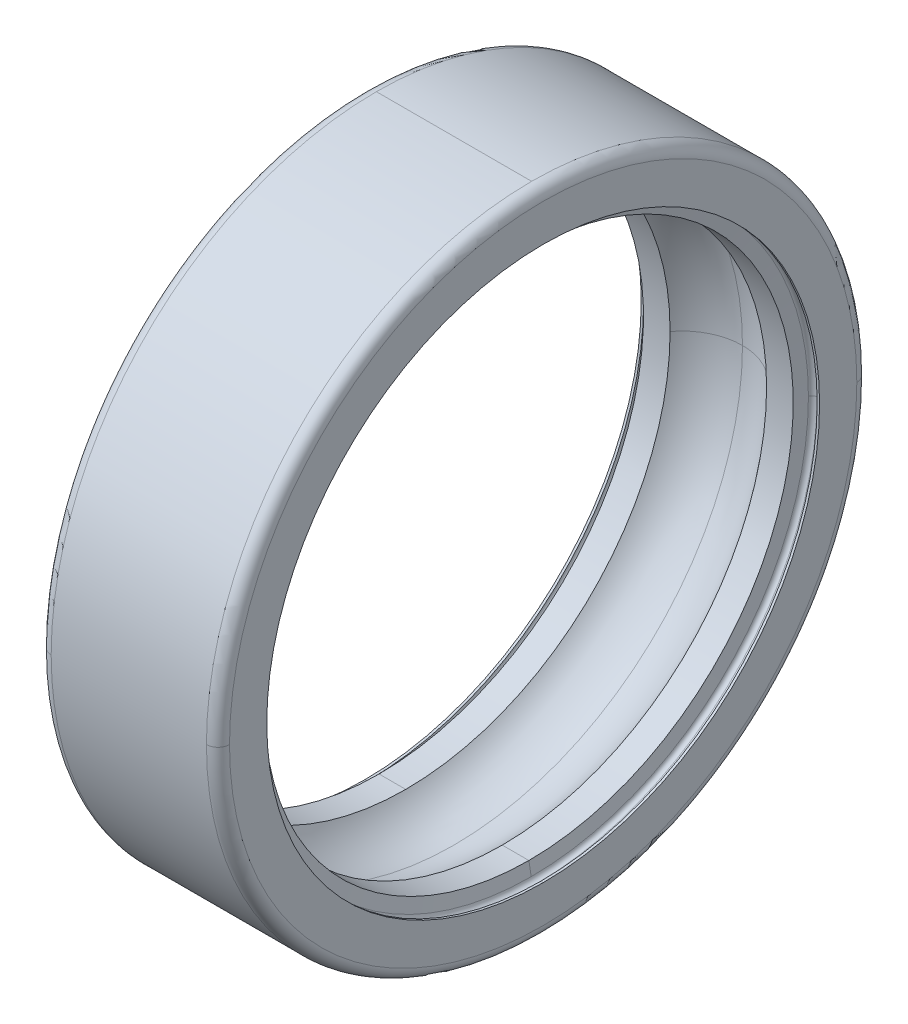
ISO-10303-21;
HEADER;
FILE_DESCRIPTION(('STEP AP214'),'2;1');
FILE_NAME('part.step','',(''),(''),'','','');
FILE_SCHEMA(('AUTOMOTIVE_DESIGN { 1 0 10303 214 1 1 1 1 }'));
ENDSEC;
DATA;
#1=APPLICATION_CONTEXT('core data for automotive mechanical design processes');
#2=APPLICATION_PROTOCOL_DEFINITION('international standard','automotive_design',2000,#1);
#3=PRODUCT_CONTEXT('',#1,'mechanical');
#4=PRODUCT('Part','Part','',(#3));
#5=PRODUCT_RELATED_PRODUCT_CATEGORY('part','',(#4));
#6=PRODUCT_DEFINITION_FORMATION('','',#4);
#7=PRODUCT_DEFINITION_CONTEXT('part definition',#1,'design');
#8=PRODUCT_DEFINITION('design','',#6,#7);
#9=PRODUCT_DEFINITION_SHAPE('','',#8);
#10=(LENGTH_UNIT() NAMED_UNIT(*) SI_UNIT(.MILLI.,.METRE.));
#11=(NAMED_UNIT(*) PLANE_ANGLE_UNIT() SI_UNIT($,.RADIAN.));
#12=(NAMED_UNIT(*) SI_UNIT($,.STERADIAN.) SOLID_ANGLE_UNIT());
#13=UNCERTAINTY_MEASURE_WITH_UNIT(LENGTH_MEASURE(1.E-05),#10,'distance_accuracy_value','');
#14=(GEOMETRIC_REPRESENTATION_CONTEXT(3) GLOBAL_UNCERTAINTY_ASSIGNED_CONTEXT((#13)) GLOBAL_UNIT_ASSIGNED_CONTEXT((#10,
#11,#12)) REPRESENTATION_CONTEXT('',''));
#15=CARTESIAN_POINT('',(0.,0.,0.));
#16=DIRECTION('',(0.,0.,1.));
#17=DIRECTION('',(1.,0.,0.));
#18=AXIS2_PLACEMENT_3D('',#15,#16,#17);
#19=CARTESIAN_POINT('',(16.31,0.,0.));
#20=DIRECTION('',(1.,0.,0.));
#21=DIRECTION('',(0.,0.,-1.));
#22=AXIS2_PLACEMENT_3D('',#19,#20,#21);
#23=TOROIDAL_SURFACE('',#22,26.35,0.46);
#24=CARTESIAN_POINT('',(16.31,0.,0.));
#25=DIRECTION('',(1.,0.,0.));
#26=DIRECTION('',(0.,0.,1.));
#27=AXIS2_PLACEMENT_3D('',#24,#25,#26);
#28=CIRCLE('',#27,26.81);
#29=CARTESIAN_POINT('',(16.31,0.,-26.81));
#30=VERTEX_POINT('',#29);
#31=CARTESIAN_POINT('',(16.31,0.,26.81));
#32=VERTEX_POINT('',#31);
#33=EDGE_CURVE('E339',#30,#32,#28,.T.);
#34=ORIENTED_EDGE('',*,*,#33,.T.);
#35=CARTESIAN_POINT('',(16.31,0.,26.35));
#36=DIRECTION('',(0.,-1.,0.));
#37=DIRECTION('',(0.,0.,1.));
#38=AXIS2_PLACEMENT_3D('',#35,#36,#37);
#39=CIRCLE('',#38,0.46);
#40=CARTESIAN_POINT('',(15.8569884336144,0.,26.4298781617268));
#41=VERTEX_POINT('',#40);
#42=EDGE_CURVE('E209',#32,#41,#39,.T.);
#43=ORIENTED_EDGE('',*,*,#42,.T.);
#44=CARTESIAN_POINT('',(15.8569884336144,0.,0.));
#45=DIRECTION('',(1.,0.,0.));
#46=DIRECTION('',(0.,1.,0.));
#47=AXIS2_PLACEMENT_3D('',#44,#45,#46);
#48=CIRCLE('',#47,26.4298781617268);
#49=CARTESIAN_POINT('',(15.8569884336144,26.4298781617268,0.));
#50=VERTEX_POINT('',#49);
#51=EDGE_CURVE('E33',#50,#41,#48,.T.);
#52=ORIENTED_EDGE('',*,*,#51,.F.);
#53=CARTESIAN_POINT('',(15.8569884336144,0.,0.));
#54=DIRECTION('',(1.,0.,0.));
#55=DIRECTION('',(0.,1.,0.));
#56=AXIS2_PLACEMENT_3D('',#53,#54,#55);
#57=CIRCLE('',#56,26.4298781617268);
#58=CARTESIAN_POINT('',(15.8569884336144,0.,-26.4298781617268));
#59=VERTEX_POINT('',#58);
#60=EDGE_CURVE('E246',#59,#50,#57,.T.);
#61=ORIENTED_EDGE('',*,*,#60,.F.);
#62=CARTESIAN_POINT('',(16.31,0.,-26.35));
#63=DIRECTION('',(0.,-1.,0.));
#64=DIRECTION('',(0.,0.,-1.));
#65=AXIS2_PLACEMENT_3D('',#62,#63,#64);
#66=CIRCLE('',#65,0.46);
#67=EDGE_CURVE('E200',#59,#30,#66,.T.);
#68=ORIENTED_EDGE('',*,*,#67,.T.);
#69=EDGE_LOOP('',(#34,#43,#52,#61,#68));
#70=FACE_BOUND('',#69,.T.);
#71=ADVANCED_FACE('F16',(#70),#23,.F.);
#72=CARTESIAN_POINT('',(16.885,0.,0.));
#73=DIRECTION('',(1.,0.,0.));
#74=DIRECTION('',(0.,1.,0.));
#75=AXIS2_PLACEMENT_3D('',#72,#73,#74);
#76=CYLINDRICAL_SURFACE('',#75,26.35);
#77=DIRECTION('',(1.,0.,0.));
#78=VECTOR('',#77,1.);
#79=CARTESIAN_POINT('',(16.885,26.35,0.));
#80=LINE('',#79,#78);
#81=CARTESIAN_POINT('',(16.77,26.35,0.));
#82=VERTEX_POINT('',#81);
#83=CARTESIAN_POINT('',(17.,26.35,0.));
#84=VERTEX_POINT('',#83);
#85=EDGE_CURVE('E211',#82,#84,#80,.T.);
#86=ORIENTED_EDGE('',*,*,#85,.T.);
#87=CARTESIAN_POINT('',(17.,0.,0.));
#88=DIRECTION('',(1.,0.,0.));
#89=DIRECTION('',(0.,1.,0.));
#90=AXIS2_PLACEMENT_3D('',#87,#88,#89);
#91=CIRCLE('',#90,26.35);
#92=CARTESIAN_POINT('',(17.,-26.35,0.));
#93=VERTEX_POINT('',#92);
#94=EDGE_CURVE('E11',#84,#93,#91,.T.);
#95=ORIENTED_EDGE('',*,*,#94,.T.);
#96=DIRECTION('',(-1.,0.,0.));
#97=VECTOR('',#96,1.);
#98=CARTESIAN_POINT('',(16.885,-26.35,0.));
#99=LINE('',#98,#97);
#100=CARTESIAN_POINT('',(16.77,-26.35,0.));
#101=VERTEX_POINT('',#100);
#102=EDGE_CURVE('E216',#93,#101,#99,.T.);
#103=ORIENTED_EDGE('',*,*,#102,.T.);
#104=CARTESIAN_POINT('',(16.77,0.,0.));
#105=DIRECTION('',(1.,0.,0.));
#106=DIRECTION('',(0.,1.,0.));
#107=AXIS2_PLACEMENT_3D('',#104,#105,#106);
#108=CIRCLE('',#107,26.35);
#109=CARTESIAN_POINT('',(16.77,0.,26.35));
#110=VERTEX_POINT('',#109);
#111=EDGE_CURVE('E419',#110,#101,#108,.T.);
#112=ORIENTED_EDGE('',*,*,#111,.F.);
#113=CARTESIAN_POINT('',(16.77,0.,0.));
#114=DIRECTION('',(1.,0.,0.));
#115=DIRECTION('',(0.,1.,0.));
#116=AXIS2_PLACEMENT_3D('',#113,#114,#115);
#117=CIRCLE('',#116,26.35);
#118=EDGE_CURVE('E364',#82,#110,#117,.T.);
#119=ORIENTED_EDGE('',*,*,#118,.F.);
#120=EDGE_LOOP('',(#86,#95,#103,#112,#119));
#121=FACE_BOUND('',#120,.T.);
#122=ADVANCED_FACE('F330',(#121),#76,.F.);
#123=CARTESIAN_POINT('',(17.,28.125,0.));
#124=DIRECTION('',(1.,0.,0.));
#125=DIRECTION('',(0.,1.,0.));
#126=AXIS2_PLACEMENT_3D('',#123,#124,#125);
#127=PLANE('',#126);
#128=ORIENTED_EDGE('',*,*,#94,.F.);
#129=CARTESIAN_POINT('',(17.,0.,0.));
#130=DIRECTION('',(1.,0.,0.));
#131=DIRECTION('',(0.,1.,0.));
#132=AXIS2_PLACEMENT_3D('',#129,#130,#131);
#133=CIRCLE('',#132,26.35);
#134=EDGE_CURVE('E220',#93,#84,#133,.T.);
#135=ORIENTED_EDGE('',*,*,#134,.F.);
#136=EDGE_LOOP('',(#128,#135));
#137=FACE_BOUND('',#136,.T.);
#138=CARTESIAN_POINT('',(17.,0.,0.));
#139=DIRECTION('',(1.,0.,0.));
#140=DIRECTION('',(0.,1.,0.));
#141=AXIS2_PLACEMENT_3D('',#138,#139,#140);
#142=CIRCLE('',#141,29.9);
#143=CARTESIAN_POINT('',(17.,0.,29.9));
#144=VERTEX_POINT('',#143);
#145=CARTESIAN_POINT('',(17.,0.,-29.9));
#146=VERTEX_POINT('',#145);
#147=EDGE_CURVE('E25',#144,#146,#142,.T.);
#148=ORIENTED_EDGE('',*,*,#147,.T.);
#149=CARTESIAN_POINT('',(17.,0.,0.));
#150=DIRECTION('',(1.,0.,0.));
#151=DIRECTION('',(0.,1.,0.));
#152=AXIS2_PLACEMENT_3D('',#149,#150,#151);
#153=CIRCLE('',#152,29.9);
#154=EDGE_CURVE('E233',#146,#144,#153,.T.);
#155=ORIENTED_EDGE('',*,*,#154,.T.);
#156=EDGE_LOOP('',(#148,#155));
#157=FACE_BOUND('',#156,.T.);
#158=ADVANCED_FACE('F334',(#137,#157),#127,.T.);
#159=CARTESIAN_POINT('',(15.9,0.,0.));
#160=DIRECTION('',(1.,0.,0.));
#161=DIRECTION('',(0.,0.,-1.));
#162=AXIS2_PLACEMENT_3D('',#159,#160,#161);
#163=TOROIDAL_SURFACE('',#162,29.9,1.1);
#164=CARTESIAN_POINT('',(15.9,0.,-29.9));
#165=DIRECTION('',(0.,-1.,0.));
#166=DIRECTION('',(0.,0.,-1.));
#167=AXIS2_PLACEMENT_3D('',#164,#165,#166);
#168=CIRCLE('',#167,1.1);
#169=CARTESIAN_POINT('',(15.9,0.,-31.));
#170=VERTEX_POINT('',#169);
#171=EDGE_CURVE('E226',#170,#146,#168,.T.);
#172=ORIENTED_EDGE('',*,*,#171,.T.);
#173=ORIENTED_EDGE('',*,*,#147,.F.);
#174=CARTESIAN_POINT('',(15.9,0.,29.9));
#175=DIRECTION('',(0.,-1.,0.));
#176=DIRECTION('',(0.,0.,1.));
#177=AXIS2_PLACEMENT_3D('',#174,#175,#176);
#178=CIRCLE('',#177,1.1);
#179=CARTESIAN_POINT('',(15.9,0.,31.));
#180=VERTEX_POINT('',#179);
#181=EDGE_CURVE('E237',#144,#180,#178,.T.);
#182=ORIENTED_EDGE('',*,*,#181,.T.);
#183=CARTESIAN_POINT('',(15.9,0.,0.));
#184=DIRECTION('',(1.,0.,0.));
#185=DIRECTION('',(0.,1.,0.));
#186=AXIS2_PLACEMENT_3D('',#183,#184,#185);
#187=CIRCLE('',#186,31.);
#188=CARTESIAN_POINT('',(15.9,-31.,0.));
#189=VERTEX_POINT('',#188);
#190=EDGE_CURVE('E253',#180,#189,#187,.T.);
#191=ORIENTED_EDGE('',*,*,#190,.T.);
#192=CARTESIAN_POINT('',(15.9,0.,0.));
#193=DIRECTION('',(1.,0.,0.));
#194=DIRECTION('',(0.,1.,0.));
#195=AXIS2_PLACEMENT_3D('',#192,#193,#194);
#196=CIRCLE('',#195,31.);
#197=EDGE_CURVE('E221',#189,#170,#196,.T.);
#198=ORIENTED_EDGE('',*,*,#197,.T.);
#199=EDGE_LOOP('',(#172,#173,#182,#191,#198));
#200=FACE_BOUND('',#199,.T.);
#201=ADVANCED_FACE('F326',(#200),#163,.T.);
#202=CARTESIAN_POINT('',(8.5,0.,0.));
#203=DIRECTION('',(1.,0.,0.));
#204=DIRECTION('',(0.,1.,0.));
#205=AXIS2_PLACEMENT_3D('',#202,#203,#204);
#206=CYLINDRICAL_SURFACE('',#205,31.);
#207=DIRECTION('',(1.,0.,0.));
#208=VECTOR('',#207,1.);
#209=CARTESIAN_POINT('',(8.5,31.,0.));
#210=LINE('',#209,#208);
#211=CARTESIAN_POINT('',(1.1,31.,0.));
#212=VERTEX_POINT('',#211);
#213=CARTESIAN_POINT('',(15.9,31.,0.));
#214=VERTEX_POINT('',#213);
#215=EDGE_CURVE('E236',#212,#214,#210,.T.);
#216=ORIENTED_EDGE('',*,*,#215,.T.);
#217=CARTESIAN_POINT('',(15.9,0.,0.));
#218=DIRECTION('',(1.,0.,0.));
#219=DIRECTION('',(0.,1.,0.));
#220=AXIS2_PLACEMENT_3D('',#217,#218,#219);
#221=CIRCLE('',#220,31.);
#222=EDGE_CURVE('E229',#170,#214,#221,.T.);
#223=ORIENTED_EDGE('',*,*,#222,.F.);
#224=ORIENTED_EDGE('',*,*,#197,.F.);
#225=DIRECTION('',(-1.,0.,0.));
#226=VECTOR('',#225,1.);
#227=CARTESIAN_POINT('',(8.5,-31.,0.));
#228=LINE('',#227,#226);
#229=CARTESIAN_POINT('',(1.1,-31.,0.));
#230=VERTEX_POINT('',#229);
#231=EDGE_CURVE('E250',#189,#230,#228,.T.);
#232=ORIENTED_EDGE('',*,*,#231,.T.);
#233=CARTESIAN_POINT('',(1.1,0.,0.));
#234=DIRECTION('',(1.,0.,0.));
#235=DIRECTION('',(0.,1.,0.));
#236=AXIS2_PLACEMENT_3D('',#233,#234,#235);
#237=CIRCLE('',#236,31.);
#238=CARTESIAN_POINT('',(1.1,0.,-31.));
#239=VERTEX_POINT('',#238);
#240=EDGE_CURVE('E19',#230,#239,#237,.T.);
#241=ORIENTED_EDGE('',*,*,#240,.T.);
#242=CARTESIAN_POINT('',(1.1,0.,0.));
#243=DIRECTION('',(1.,0.,0.));
#244=DIRECTION('',(0.,1.,0.));
#245=AXIS2_PLACEMENT_3D('',#242,#243,#244);
#246=CIRCLE('',#245,31.);
#247=EDGE_CURVE('E269',#239,#212,#246,.T.);
#248=ORIENTED_EDGE('',*,*,#247,.T.);
#249=EDGE_LOOP('',(#216,#223,#224,#232,#241,#248));
#250=FACE_BOUND('',#249,.T.);
#251=ADVANCED_FACE('F306',(#250),#206,.T.);
#252=CARTESIAN_POINT('',(1.1,0.,0.));
#253=DIRECTION('',(1.,0.,0.));
#254=DIRECTION('',(0.,0.,-1.));
#255=AXIS2_PLACEMENT_3D('',#252,#253,#254);
#256=TOROIDAL_SURFACE('',#255,29.9,1.1);
#257=CARTESIAN_POINT('',(1.1,0.,-29.9));
#258=DIRECTION('',(0.,-1.,0.));
#259=DIRECTION('',(0.,0.,-1.));
#260=AXIS2_PLACEMENT_3D('',#257,#258,#259);
#261=CIRCLE('',#260,1.1);
#262=CARTESIAN_POINT('',(0.,0.,-29.9));
#263=VERTEX_POINT('',#262);
#264=EDGE_CURVE('E257',#263,#239,#261,.T.);
#265=ORIENTED_EDGE('',*,*,#264,.T.);
#266=ORIENTED_EDGE('',*,*,#240,.F.);
#267=CARTESIAN_POINT('',(1.1,0.,0.));
#268=DIRECTION('',(1.,0.,0.));
#269=DIRECTION('',(0.,1.,0.));
#270=AXIS2_PLACEMENT_3D('',#267,#268,#269);
#271=CIRCLE('',#270,31.);
#272=CARTESIAN_POINT('',(1.1,0.,31.));
#273=VERTEX_POINT('',#272);
#274=EDGE_CURVE('E243',#273,#230,#271,.T.);
#275=ORIENTED_EDGE('',*,*,#274,.F.);
#276=CARTESIAN_POINT('',(1.1,0.,29.9));
#277=DIRECTION('',(0.,-1.,0.));
#278=DIRECTION('',(0.,0.,1.));
#279=AXIS2_PLACEMENT_3D('',#276,#277,#278);
#280=CIRCLE('',#279,1.1);
#281=CARTESIAN_POINT('',(0.,0.,29.9));
#282=VERTEX_POINT('',#281);
#283=EDGE_CURVE('E266',#273,#282,#280,.T.);
#284=ORIENTED_EDGE('',*,*,#283,.T.);
#285=CARTESIAN_POINT('',(0.,0.,0.));
#286=DIRECTION('',(1.,0.,0.));
#287=DIRECTION('',(0.,1.,0.));
#288=AXIS2_PLACEMENT_3D('',#285,#286,#287);
#289=CIRCLE('',#288,29.9);
#290=EDGE_CURVE('E260',#282,#263,#289,.T.);
#291=ORIENTED_EDGE('',*,*,#290,.T.);
#292=EDGE_LOOP('',(#265,#266,#275,#284,#291));
#293=FACE_BOUND('',#292,.T.);
#294=ADVANCED_FACE('F314',(#293),#256,.T.);
#295=CARTESIAN_POINT('',(0.,28.125,0.));
#296=DIRECTION('',(-1.,0.,0.));
#297=DIRECTION('',(0.,0.,1.));
#298=AXIS2_PLACEMENT_3D('',#295,#296,#297);
#299=PLANE('',#298);
#300=CARTESIAN_POINT('',(0.,0.,0.));
#301=DIRECTION('',(1.,0.,0.));
#302=DIRECTION('',(0.,1.,0.));
#303=AXIS2_PLACEMENT_3D('',#300,#301,#302);
#304=CIRCLE('',#303,26.35);
#305=CARTESIAN_POINT('',(0.,26.35,0.));
#306=VERTEX_POINT('',#305);
#307=CARTESIAN_POINT('',(0.,-26.35,0.));
#308=VERTEX_POINT('',#307);
#309=EDGE_CURVE('E258',#306,#308,#304,.T.);
#310=ORIENTED_EDGE('',*,*,#309,.T.);
#311=CARTESIAN_POINT('',(0.,0.,0.));
#312=DIRECTION('',(1.,0.,0.));
#313=DIRECTION('',(0.,1.,0.));
#314=AXIS2_PLACEMENT_3D('',#311,#312,#313);
#315=CIRCLE('',#314,26.35);
#316=EDGE_CURVE('E280',#308,#306,#315,.T.);
#317=ORIENTED_EDGE('',*,*,#316,.T.);
#318=EDGE_LOOP('',(#310,#317));
#319=FACE_BOUND('',#318,.T.);
#320=CARTESIAN_POINT('',(0.,0.,0.));
#321=DIRECTION('',(1.,0.,0.));
#322=DIRECTION('',(0.,1.,0.));
#323=AXIS2_PLACEMENT_3D('',#320,#321,#322);
#324=CIRCLE('',#323,29.9);
#325=EDGE_CURVE('E263',#263,#282,#324,.T.);
#326=ORIENTED_EDGE('',*,*,#325,.F.);
#327=ORIENTED_EDGE('',*,*,#290,.F.);
#328=EDGE_LOOP('',(#326,#327));
#329=FACE_BOUND('',#328,.T.);
#330=ADVANCED_FACE('F316',(#319,#329),#299,.T.);
#331=CARTESIAN_POINT('',(0.114999999999998,0.,0.));
#332=DIRECTION('',(1.,0.,0.));
#333=DIRECTION('',(0.,1.,0.));
#334=AXIS2_PLACEMENT_3D('',#331,#332,#333);
#335=CYLINDRICAL_SURFACE('',#334,26.35);
#336=DIRECTION('',(1.,0.,0.));
#337=VECTOR('',#336,1.);
#338=CARTESIAN_POINT('',(0.114999999999998,26.35,0.));
#339=LINE('',#338,#337);
#340=CARTESIAN_POINT('',(0.23,26.35,0.));
#341=VERTEX_POINT('',#340);
#342=EDGE_CURVE('E276',#306,#341,#339,.T.);
#343=ORIENTED_EDGE('',*,*,#342,.T.);
#344=CARTESIAN_POINT('',(0.23,0.,0.));
#345=DIRECTION('',(1.,0.,0.));
#346=DIRECTION('',(0.,1.,0.));
#347=AXIS2_PLACEMENT_3D('',#344,#345,#346);
#348=CIRCLE('',#347,26.35);
#349=CARTESIAN_POINT('',(0.23,0.,26.35));
#350=VERTEX_POINT('',#349);
#351=EDGE_CURVE('E169',#341,#350,#348,.T.);
#352=ORIENTED_EDGE('',*,*,#351,.T.);
#353=CARTESIAN_POINT('',(0.23,0.,0.));
#354=DIRECTION('',(1.,0.,0.));
#355=DIRECTION('',(0.,1.,0.));
#356=AXIS2_PLACEMENT_3D('',#353,#354,#355);
#357=CIRCLE('',#356,26.35);
#358=CARTESIAN_POINT('',(0.23,-26.35,0.));
#359=VERTEX_POINT('',#358);
#360=EDGE_CURVE('E289',#350,#359,#357,.T.);
#361=ORIENTED_EDGE('',*,*,#360,.T.);
#362=DIRECTION('',(-1.,0.,0.));
#363=VECTOR('',#362,1.);
#364=CARTESIAN_POINT('',(0.114999999999998,-26.35,0.));
#365=LINE('',#364,#363);
#366=EDGE_CURVE('E285',#359,#308,#365,.T.);
#367=ORIENTED_EDGE('',*,*,#366,.T.);
#368=ORIENTED_EDGE('',*,*,#309,.F.);
#369=EDGE_LOOP('',(#343,#352,#361,#367,#368));
#370=FACE_BOUND('',#369,.T.);
#371=ADVANCED_FACE('F323',(#370),#335,.F.);
#372=CARTESIAN_POINT('',(0.69,0.,0.));
#373=DIRECTION('',(1.,0.,0.));
#374=DIRECTION('',(0.,0.,-1.));
#375=AXIS2_PLACEMENT_3D('',#372,#373,#374);
#376=TOROIDAL_SURFACE('',#375,26.35,0.46);
#377=CARTESIAN_POINT('',(0.69,0.,0.));
#378=DIRECTION('',(1.,0.,0.));
#379=DIRECTION('',(0.,0.,1.));
#380=AXIS2_PLACEMENT_3D('',#377,#378,#379);
#381=CIRCLE('',#380,26.81);
#382=CARTESIAN_POINT('',(0.69,0.,-26.81));
#383=VERTEX_POINT('',#382);
#384=CARTESIAN_POINT('',(0.69,0.,26.81));
#385=VERTEX_POINT('',#384);
#386=EDGE_CURVE('E380',#383,#385,#381,.T.);
#387=ORIENTED_EDGE('',*,*,#386,.T.);
#388=CARTESIAN_POINT('',(0.69,0.,26.35));
#389=DIRECTION('',(0.,-1.,0.));
#390=DIRECTION('',(0.,0.,1.));
#391=AXIS2_PLACEMENT_3D('',#388,#389,#390);
#392=CIRCLE('',#391,0.46);
#393=EDGE_CURVE('E194',#385,#350,#392,.T.);
#394=ORIENTED_EDGE('',*,*,#393,.T.);
#395=ORIENTED_EDGE('',*,*,#351,.F.);
#396=CARTESIAN_POINT('',(0.23,0.,0.));
#397=DIRECTION('',(1.,0.,0.));
#398=DIRECTION('',(0.,1.,0.));
#399=AXIS2_PLACEMENT_3D('',#396,#397,#398);
#400=CIRCLE('',#399,26.35);
#401=CARTESIAN_POINT('',(0.23,0.,-26.35));
#402=VERTEX_POINT('',#401);
#403=EDGE_CURVE('E284',#402,#341,#400,.T.);
#404=ORIENTED_EDGE('',*,*,#403,.F.);
#405=CARTESIAN_POINT('',(0.69,0.,-26.35));
#406=DIRECTION('',(0.,-1.,0.));
#407=DIRECTION('',(0.,0.,-1.));
#408=AXIS2_PLACEMENT_3D('',#405,#406,#407);
#409=CIRCLE('',#408,0.46);
#410=EDGE_CURVE('E286',#402,#383,#409,.T.);
#411=ORIENTED_EDGE('',*,*,#410,.T.);
#412=EDGE_LOOP('',(#387,#394,#395,#404,#411));
#413=FACE_BOUND('',#412,.T.);
#414=ADVANCED_FACE('F516',(#413),#376,.F.);
#415=CARTESIAN_POINT('',(1.2514419178339,0.,0.));
#416=DIRECTION('',(-1.,0.,0.));
#417=DIRECTION('',(0.,1.,0.));
#418=AXIS2_PLACEMENT_3D('',#415,#416,#417);
#419=CONICAL_SURFACE('',#418,25.8149390808634,1.39626340159546);
#420=DIRECTION('',(0.173648177666931,-0.984807753012208,0.));
#421=VECTOR('',#420,1.);
#422=CARTESIAN_POINT('',(1.2514419178339,25.8149390808634,0.));
#423=LINE('',#422,#421);
#424=CARTESIAN_POINT('',(1.14301156638562,26.4298781617268,0.));
#425=VERTEX_POINT('',#424);
#426=CARTESIAN_POINT('',(1.35987226928218,25.2,0.));
#427=VERTEX_POINT('',#426);
#428=EDGE_CURVE('E167',#425,#427,#423,.T.);
#429=ORIENTED_EDGE('',*,*,#428,.T.);
#430=CARTESIAN_POINT('',(1.35987226928218,0.,0.));
#431=DIRECTION('',(1.,0.,0.));
#432=DIRECTION('',(0.,1.,0.));
#433=AXIS2_PLACEMENT_3D('',#430,#431,#432);
#434=CIRCLE('',#433,25.2);
#435=CARTESIAN_POINT('',(1.35987226928218,-25.2,0.));
#436=VERTEX_POINT('',#435);
#437=EDGE_CURVE('E160',#427,#436,#434,.T.);
#438=ORIENTED_EDGE('',*,*,#437,.T.);
#439=DIRECTION('',(-0.173648177666931,-0.984807753012208,0.));
#440=VECTOR('',#439,1.);
#441=CARTESIAN_POINT('',(1.2514419178339,-25.8149390808634,0.));
#442=LINE('',#441,#440);
#443=CARTESIAN_POINT('',(1.14301156638562,-26.4298781617268,0.));
#444=VERTEX_POINT('',#443);
#445=EDGE_CURVE('E164',#436,#444,#442,.T.);
#446=ORIENTED_EDGE('',*,*,#445,.T.);
#447=CARTESIAN_POINT('',(1.14301156638562,0.,0.));
#448=DIRECTION('',(1.,0.,0.));
#449=DIRECTION('',(0.,1.,0.));
#450=AXIS2_PLACEMENT_3D('',#447,#448,#449);
#451=CIRCLE('',#450,26.4298781617268);
#452=CARTESIAN_POINT('',(1.14301156638562,0.,26.4298781617268));
#453=VERTEX_POINT('',#452);
#454=EDGE_CURVE('E411',#453,#444,#451,.T.);
#455=ORIENTED_EDGE('',*,*,#454,.F.);
#456=CARTESIAN_POINT('',(1.14301156638562,0.,0.));
#457=DIRECTION('',(1.,0.,0.));
#458=DIRECTION('',(0.,1.,0.));
#459=AXIS2_PLACEMENT_3D('',#456,#457,#458);
#460=CIRCLE('',#459,26.4298781617268);
#461=EDGE_CURVE('E389',#425,#453,#460,.T.);
#462=ORIENTED_EDGE('',*,*,#461,.F.);
#463=EDGE_LOOP('',(#429,#438,#446,#455,#462));
#464=FACE_BOUND('',#463,.T.);
#465=ADVANCED_FACE('F162',(#464),#419,.F.);
#466=CARTESIAN_POINT('',(2.62993613464109,0.,0.));
#467=DIRECTION('',(1.,0.,0.));
#468=DIRECTION('',(0.,1.,0.));
#469=AXIS2_PLACEMENT_3D('',#466,#467,#468);
#470=CYLINDRICAL_SURFACE('',#469,25.2);
#471=DIRECTION('',(1.,0.,0.));
#472=VECTOR('',#471,1.);
#473=CARTESIAN_POINT('',(2.62993613464109,25.2,0.));
#474=LINE('',#473,#472);
#475=CARTESIAN_POINT('',(3.9,25.2,0.));
#476=VERTEX_POINT('',#475);
#477=EDGE_CURVE('E181',#427,#476,#474,.T.);
#478=ORIENTED_EDGE('',*,*,#477,.T.);
#479=CARTESIAN_POINT('',(3.9,0.,0.));
#480=DIRECTION('',(1.,0.,0.));
#481=DIRECTION('',(0.,1.,0.));
#482=AXIS2_PLACEMENT_3D('',#479,#480,#481);
#483=CIRCLE('',#482,25.2);
#484=CARTESIAN_POINT('',(3.9,0.,25.2));
#485=VERTEX_POINT('',#484);
#486=EDGE_CURVE('E113',#476,#485,#483,.T.);
#487=ORIENTED_EDGE('',*,*,#486,.T.);
#488=CARTESIAN_POINT('',(3.9,0.,0.));
#489=DIRECTION('',(1.,0.,0.));
#490=DIRECTION('',(0.,1.,0.));
#491=AXIS2_PLACEMENT_3D('',#488,#489,#490);
#492=CIRCLE('',#491,25.2);
#493=CARTESIAN_POINT('',(3.9,-25.2,0.));
#494=VERTEX_POINT('',#493);
#495=EDGE_CURVE('E176',#485,#494,#492,.T.);
#496=ORIENTED_EDGE('',*,*,#495,.T.);
#497=DIRECTION('',(-1.,0.,0.));
#498=VECTOR('',#497,1.);
#499=CARTESIAN_POINT('',(2.62993613464109,-25.2,0.));
#500=LINE('',#499,#498);
#501=EDGE_CURVE('E172',#494,#436,#500,.T.);
#502=ORIENTED_EDGE('',*,*,#501,.T.);
#503=ORIENTED_EDGE('',*,*,#437,.F.);
#504=EDGE_LOOP('',(#478,#487,#496,#502,#503));
#505=FACE_BOUND('',#504,.T.);
#506=ADVANCED_FACE('F174',(#505),#470,.F.);
#507=CARTESIAN_POINT('',(8.5,0.,0.));
#508=DIRECTION('',(1.,0.,0.));
#509=DIRECTION('',(0.,0.,-1.));
#510=AXIS2_PLACEMENT_3D('',#507,#508,#509);
#511=TOROIDAL_SURFACE('',#510,21.75,5.75);
#512=CARTESIAN_POINT('',(8.5,0.,0.));
#513=DIRECTION('',(1.,0.,0.));
#514=DIRECTION('',(0.,0.,1.));
#515=AXIS2_PLACEMENT_3D('',#512,#513,#514);
#516=CIRCLE('',#515,27.5);
#517=CARTESIAN_POINT('',(8.5,0.,-27.5));
#518=VERTEX_POINT('',#517);
#519=CARTESIAN_POINT('',(8.5,0.,27.5));
#520=VERTEX_POINT('',#519);
#521=EDGE_CURVE('E357',#518,#520,#516,.T.);
#522=ORIENTED_EDGE('',*,*,#521,.T.);
#523=CARTESIAN_POINT('',(8.5,0.,21.75));
#524=DIRECTION('',(0.,-1.,0.));
#525=DIRECTION('',(0.,0.,1.));
#526=AXIS2_PLACEMENT_3D('',#523,#524,#525);
#527=CIRCLE('',#526,5.75);
#528=EDGE_CURVE('E274',#520,#485,#527,.T.);
#529=ORIENTED_EDGE('',*,*,#528,.T.);
#530=ORIENTED_EDGE('',*,*,#486,.F.);
#531=CARTESIAN_POINT('',(3.9,0.,0.));
#532=DIRECTION('',(1.,0.,0.));
#533=DIRECTION('',(0.,1.,0.));
#534=AXIS2_PLACEMENT_3D('',#531,#532,#533);
#535=CIRCLE('',#534,25.2);
#536=CARTESIAN_POINT('',(3.9,0.,-25.2));
#537=VERTEX_POINT('',#536);
#538=EDGE_CURVE('E213',#537,#476,#535,.T.);
#539=ORIENTED_EDGE('',*,*,#538,.F.);
#540=CARTESIAN_POINT('',(8.5,0.,-21.75));
#541=DIRECTION('',(0.,-1.,0.));
#542=DIRECTION('',(0.,0.,-1.));
#543=AXIS2_PLACEMENT_3D('',#540,#541,#542);
#544=CIRCLE('',#543,5.75);
#545=EDGE_CURVE('E218',#537,#518,#544,.T.);
#546=ORIENTED_EDGE('',*,*,#545,.T.);
#547=EDGE_LOOP('',(#522,#529,#530,#539,#546));
#548=FACE_BOUND('',#547,.T.);
#549=ADVANCED_FACE('F507',(#548),#511,.F.);
#550=CARTESIAN_POINT('',(14.3700638653589,0.,0.));
#551=DIRECTION('',(1.,0.,0.));
#552=DIRECTION('',(0.,1.,0.));
#553=AXIS2_PLACEMENT_3D('',#550,#551,#552);
#554=CYLINDRICAL_SURFACE('',#553,25.2);
#555=DIRECTION('',(1.,0.,0.));
#556=VECTOR('',#555,1.);
#557=CARTESIAN_POINT('',(14.3700638653589,25.2,0.));
#558=LINE('',#557,#556);
#559=CARTESIAN_POINT('',(13.1,25.2,0.));
#560=VERTEX_POINT('',#559);
#561=CARTESIAN_POINT('',(15.6401277307178,25.2,0.));
#562=VERTEX_POINT('',#561);
#563=EDGE_CURVE('E270',#560,#562,#558,.T.);
#564=ORIENTED_EDGE('',*,*,#563,.T.);
#565=CARTESIAN_POINT('',(15.6401277307178,0.,0.));
#566=DIRECTION('',(1.,0.,0.));
#567=DIRECTION('',(0.,1.,0.));
#568=AXIS2_PLACEMENT_3D('',#565,#566,#567);
#569=CIRCLE('',#568,25.2);
#570=CARTESIAN_POINT('',(15.6401277307178,-25.2,0.));
#571=VERTEX_POINT('',#570);
#572=EDGE_CURVE('E120',#562,#571,#569,.T.);
#573=ORIENTED_EDGE('',*,*,#572,.T.);
#574=DIRECTION('',(-1.,0.,0.));
#575=VECTOR('',#574,1.);
#576=CARTESIAN_POINT('',(14.3700638653589,-25.2,0.));
#577=LINE('',#576,#575);
#578=CARTESIAN_POINT('',(13.1,-25.2,0.));
#579=VERTEX_POINT('',#578);
#580=EDGE_CURVE('E273',#571,#579,#577,.T.);
#581=ORIENTED_EDGE('',*,*,#580,.T.);
#582=CARTESIAN_POINT('',(13.1,0.,0.));
#583=DIRECTION('',(1.,0.,0.));
#584=DIRECTION('',(0.,1.,0.));
#585=AXIS2_PLACEMENT_3D('',#582,#583,#584);
#586=CIRCLE('',#585,25.2);
#587=CARTESIAN_POINT('',(13.1,0.,25.2));
#588=VERTEX_POINT('',#587);
#589=EDGE_CURVE('E398',#588,#579,#586,.T.);
#590=ORIENTED_EDGE('',*,*,#589,.F.);
#591=CARTESIAN_POINT('',(13.1,0.,0.));
#592=DIRECTION('',(1.,0.,0.));
#593=DIRECTION('',(0.,1.,0.));
#594=AXIS2_PLACEMENT_3D('',#591,#592,#593);
#595=CIRCLE('',#594,25.2);
#596=EDGE_CURVE('E355',#560,#588,#595,.T.);
#597=ORIENTED_EDGE('',*,*,#596,.F.);
#598=EDGE_LOOP('',(#564,#573,#581,#590,#597));
#599=FACE_BOUND('',#598,.T.);
#600=ADVANCED_FACE('F504',(#599),#554,.F.);
#601=CARTESIAN_POINT('',(15.7485580821661,0.,0.));
#602=DIRECTION('',(1.,0.,0.));
#603=DIRECTION('',(0.,1.,0.));
#604=AXIS2_PLACEMENT_3D('',#601,#602,#603);
#605=CONICAL_SURFACE('',#604,25.8149390808634,1.39626340159546);
#606=DIRECTION('',(0.173648177666933,0.984807753012208,0.));
#607=VECTOR('',#606,1.);
#608=CARTESIAN_POINT('',(15.7485580821661,25.8149390808634,0.));
#609=LINE('',#608,#607);
#610=EDGE_CURVE('E247',#562,#50,#609,.T.);
#611=ORIENTED_EDGE('',*,*,#610,.T.);
#612=ORIENTED_EDGE('',*,*,#51,.T.);
#613=CARTESIAN_POINT('',(15.8569884336144,0.,0.));
#614=DIRECTION('',(1.,0.,0.));
#615=DIRECTION('',(0.,1.,0.));
#616=AXIS2_PLACEMENT_3D('',#613,#614,#615);
#617=CIRCLE('',#616,26.4298781617268);
#618=CARTESIAN_POINT('',(15.8569884336144,-26.4298781617268,0.));
#619=VERTEX_POINT('',#618);
#620=EDGE_CURVE('E206',#41,#619,#617,.T.);
#621=ORIENTED_EDGE('',*,*,#620,.T.);
#622=DIRECTION('',(-0.173648177666933,0.984807753012208,0.));
#623=VECTOR('',#622,1.);
#624=CARTESIAN_POINT('',(15.7485580821661,-25.8149390808634,0.));
#625=LINE('',#624,#623);
#626=EDGE_CURVE('E244',#619,#571,#625,.T.);
#627=ORIENTED_EDGE('',*,*,#626,.T.);
#628=ORIENTED_EDGE('',*,*,#572,.F.);
#629=EDGE_LOOP('',(#611,#612,#621,#627,#628));
#630=FACE_BOUND('',#629,.T.);
#631=ADVANCED_FACE('F500',(#630),#605,.F.);
#632=CARTESIAN_POINT('',(15.7485580821661,0.,0.));
#633=DIRECTION('',(1.,0.,0.));
#634=DIRECTION('',(0.,1.,0.));
#635=AXIS2_PLACEMENT_3D('',#632,#633,#634);
#636=CONICAL_SURFACE('',#635,25.8149390808634,1.39626340159546);
#637=ORIENTED_EDGE('',*,*,#610,.F.);
#638=CARTESIAN_POINT('',(15.6401277307178,0.,0.));
#639=DIRECTION('',(1.,0.,0.));
#640=DIRECTION('',(0.,1.,0.));
#641=AXIS2_PLACEMENT_3D('',#638,#639,#640);
#642=CIRCLE('',#641,25.2);
#643=EDGE_CURVE('E296',#571,#562,#642,.T.);
#644=ORIENTED_EDGE('',*,*,#643,.F.);
#645=ORIENTED_EDGE('',*,*,#626,.F.);
#646=CARTESIAN_POINT('',(15.8569884336144,0.,0.));
#647=DIRECTION('',(1.,0.,0.));
#648=DIRECTION('',(0.,1.,0.));
#649=AXIS2_PLACEMENT_3D('',#646,#647,#648);
#650=CIRCLE('',#649,26.4298781617268);
#651=EDGE_CURVE('E202',#619,#59,#650,.T.);
#652=ORIENTED_EDGE('',*,*,#651,.T.);
#653=ORIENTED_EDGE('',*,*,#60,.T.);
#654=EDGE_LOOP('',(#637,#644,#645,#652,#653));
#655=FACE_BOUND('',#654,.T.);
#656=ADVANCED_FACE('F496',(#655),#636,.F.);
#657=CARTESIAN_POINT('',(14.3700638653589,0.,0.));
#658=DIRECTION('',(1.,0.,0.));
#659=DIRECTION('',(0.,1.,0.));
#660=AXIS2_PLACEMENT_3D('',#657,#658,#659);
#661=CYLINDRICAL_SURFACE('',#660,25.2);
#662=ORIENTED_EDGE('',*,*,#563,.F.);
#663=CARTESIAN_POINT('',(13.1,0.,0.));
#664=DIRECTION('',(1.,0.,0.));
#665=DIRECTION('',(0.,1.,0.));
#666=AXIS2_PLACEMENT_3D('',#663,#664,#665);
#667=CIRCLE('',#666,25.2);
#668=CARTESIAN_POINT('',(13.1,0.,-25.2));
#669=VERTEX_POINT('',#668);
#670=EDGE_CURVE('E376',#669,#560,#667,.T.);
#671=ORIENTED_EDGE('',*,*,#670,.F.);
#672=CARTESIAN_POINT('',(13.1,0.,0.));
#673=DIRECTION('',(1.,0.,0.));
#674=DIRECTION('',(0.,1.,0.));
#675=AXIS2_PLACEMENT_3D('',#672,#673,#674);
#676=CIRCLE('',#675,25.2);
#677=EDGE_CURVE('E403',#579,#669,#676,.T.);
#678=ORIENTED_EDGE('',*,*,#677,.F.);
#679=ORIENTED_EDGE('',*,*,#580,.F.);
#680=ORIENTED_EDGE('',*,*,#643,.T.);
#681=EDGE_LOOP('',(#662,#671,#678,#679,#680));
#682=FACE_BOUND('',#681,.T.);
#683=ADVANCED_FACE('F488',(#682),#661,.F.);
#684=CARTESIAN_POINT('',(8.5,0.,0.));
#685=DIRECTION('',(1.,0.,0.));
#686=DIRECTION('',(0.,0.,-1.));
#687=AXIS2_PLACEMENT_3D('',#684,#685,#686);
#688=TOROIDAL_SURFACE('',#687,21.75,5.75);
#689=CARTESIAN_POINT('',(8.5,0.,0.));
#690=DIRECTION('',(1.,0.,0.));
#691=DIRECTION('',(0.,0.,1.));
#692=AXIS2_PLACEMENT_3D('',#689,#690,#691);
#693=CIRCLE('',#692,27.5);
#694=EDGE_CURVE('E368',#520,#518,#693,.T.);
#695=ORIENTED_EDGE('',*,*,#694,.T.);
#696=ORIENTED_EDGE('',*,*,#545,.F.);
#697=CARTESIAN_POINT('',(3.9,0.,0.));
#698=DIRECTION('',(1.,0.,0.));
#699=DIRECTION('',(0.,1.,0.));
#700=AXIS2_PLACEMENT_3D('',#697,#698,#699);
#701=CIRCLE('',#700,25.2);
#702=EDGE_CURVE('E180',#494,#537,#701,.T.);
#703=ORIENTED_EDGE('',*,*,#702,.F.);
#704=ORIENTED_EDGE('',*,*,#495,.F.);
#705=ORIENTED_EDGE('',*,*,#528,.F.);
#706=EDGE_LOOP('',(#695,#696,#703,#704,#705));
#707=FACE_BOUND('',#706,.T.);
#708=ADVANCED_FACE('F484',(#707),#688,.F.);
#709=CARTESIAN_POINT('',(2.62993613464109,0.,0.));
#710=DIRECTION('',(1.,0.,0.));
#711=DIRECTION('',(0.,1.,0.));
#712=AXIS2_PLACEMENT_3D('',#709,#710,#711);
#713=CYLINDRICAL_SURFACE('',#712,25.2);
#714=ORIENTED_EDGE('',*,*,#477,.F.);
#715=CARTESIAN_POINT('',(1.35987226928218,0.,0.));
#716=DIRECTION('',(1.,0.,0.));
#717=DIRECTION('',(0.,1.,0.));
#718=AXIS2_PLACEMENT_3D('',#715,#716,#717);
#719=CIRCLE('',#718,25.2);
#720=EDGE_CURVE('E184',#436,#427,#719,.T.);
#721=ORIENTED_EDGE('',*,*,#720,.F.);
#722=ORIENTED_EDGE('',*,*,#501,.F.);
#723=ORIENTED_EDGE('',*,*,#702,.T.);
#724=ORIENTED_EDGE('',*,*,#538,.T.);
#725=EDGE_LOOP('',(#714,#721,#722,#723,#724));
#726=FACE_BOUND('',#725,.T.);
#727=ADVANCED_FACE('F185',(#726),#713,.F.);
#728=CARTESIAN_POINT('',(1.2514419178339,0.,0.));
#729=DIRECTION('',(-1.,0.,0.));
#730=DIRECTION('',(0.,1.,0.));
#731=AXIS2_PLACEMENT_3D('',#728,#729,#730);
#732=CONICAL_SURFACE('',#731,25.8149390808634,1.39626340159546);
#733=ORIENTED_EDGE('',*,*,#428,.F.);
#734=CARTESIAN_POINT('',(1.14301156638562,0.,0.));
#735=DIRECTION('',(1.,0.,0.));
#736=DIRECTION('',(0.,1.,0.));
#737=AXIS2_PLACEMENT_3D('',#734,#735,#736);
#738=CIRCLE('',#737,26.4298781617268);
#739=CARTESIAN_POINT('',(1.14301156638562,0.,-26.4298781617268));
#740=VERTEX_POINT('',#739);
#741=EDGE_CURVE('E386',#740,#425,#738,.T.);
#742=ORIENTED_EDGE('',*,*,#741,.F.);
#743=CARTESIAN_POINT('',(1.14301156638562,0.,0.));
#744=DIRECTION('',(1.,0.,0.));
#745=DIRECTION('',(0.,1.,0.));
#746=AXIS2_PLACEMENT_3D('',#743,#744,#745);
#747=CIRCLE('',#746,26.4298781617268);
#748=EDGE_CURVE('E191',#444,#740,#747,.T.);
#749=ORIENTED_EDGE('',*,*,#748,.F.);
#750=ORIENTED_EDGE('',*,*,#445,.F.);
#751=ORIENTED_EDGE('',*,*,#720,.T.);
#752=EDGE_LOOP('',(#733,#742,#749,#750,#751));
#753=FACE_BOUND('',#752,.T.);
#754=ADVANCED_FACE('F189',(#753),#732,.F.);
#755=CARTESIAN_POINT('',(0.69,0.,0.));
#756=DIRECTION('',(1.,0.,0.));
#757=DIRECTION('',(0.,0.,-1.));
#758=AXIS2_PLACEMENT_3D('',#755,#756,#757);
#759=TOROIDAL_SURFACE('',#758,26.35,0.46);
#760=CARTESIAN_POINT('',(0.69,0.,0.));
#761=DIRECTION('',(1.,0.,0.));
#762=DIRECTION('',(0.,0.,1.));
#763=AXIS2_PLACEMENT_3D('',#760,#761,#762);
#764=CIRCLE('',#763,26.81);
#765=EDGE_CURVE('E408',#385,#383,#764,.T.);
#766=ORIENTED_EDGE('',*,*,#765,.T.);
#767=ORIENTED_EDGE('',*,*,#410,.F.);
#768=CARTESIAN_POINT('',(0.23,0.,0.));
#769=DIRECTION('',(1.,0.,0.));
#770=DIRECTION('',(0.,1.,0.));
#771=AXIS2_PLACEMENT_3D('',#768,#769,#770);
#772=CIRCLE('',#771,26.35);
#773=EDGE_CURVE('E281',#359,#402,#772,.T.);
#774=ORIENTED_EDGE('',*,*,#773,.F.);
#775=ORIENTED_EDGE('',*,*,#360,.F.);
#776=ORIENTED_EDGE('',*,*,#393,.F.);
#777=EDGE_LOOP('',(#766,#767,#774,#775,#776));
#778=FACE_BOUND('',#777,.T.);
#779=ADVANCED_FACE('F450',(#778),#759,.F.);
#780=CARTESIAN_POINT('',(0.114999999999998,0.,0.));
#781=DIRECTION('',(1.,0.,0.));
#782=DIRECTION('',(0.,1.,0.));
#783=AXIS2_PLACEMENT_3D('',#780,#781,#782);
#784=CYLINDRICAL_SURFACE('',#783,26.35);
#785=ORIENTED_EDGE('',*,*,#342,.F.);
#786=ORIENTED_EDGE('',*,*,#316,.F.);
#787=ORIENTED_EDGE('',*,*,#366,.F.);
#788=ORIENTED_EDGE('',*,*,#773,.T.);
#789=ORIENTED_EDGE('',*,*,#403,.T.);
#790=EDGE_LOOP('',(#785,#786,#787,#788,#789));
#791=FACE_BOUND('',#790,.T.);
#792=ADVANCED_FACE('F453',(#791),#784,.F.);
#793=CARTESIAN_POINT('',(1.1,0.,0.));
#794=DIRECTION('',(1.,0.,0.));
#795=DIRECTION('',(0.,0.,-1.));
#796=AXIS2_PLACEMENT_3D('',#793,#794,#795);
#797=TOROIDAL_SURFACE('',#796,29.9,1.1);
#798=ORIENTED_EDGE('',*,*,#264,.F.);
#799=ORIENTED_EDGE('',*,*,#325,.T.);
#800=ORIENTED_EDGE('',*,*,#283,.F.);
#801=CARTESIAN_POINT('',(1.1,0.,0.));
#802=DIRECTION('',(1.,0.,0.));
#803=DIRECTION('',(0.,1.,0.));
#804=AXIS2_PLACEMENT_3D('',#801,#802,#803);
#805=CIRCLE('',#804,31.);
#806=EDGE_CURVE('E240',#212,#273,#805,.T.);
#807=ORIENTED_EDGE('',*,*,#806,.F.);
#808=ORIENTED_EDGE('',*,*,#247,.F.);
#809=EDGE_LOOP('',(#798,#799,#800,#807,#808));
#810=FACE_BOUND('',#809,.T.);
#811=ADVANCED_FACE('F312',(#810),#797,.T.);
#812=CARTESIAN_POINT('',(8.5,0.,0.));
#813=DIRECTION('',(1.,0.,0.));
#814=DIRECTION('',(0.,1.,0.));
#815=AXIS2_PLACEMENT_3D('',#812,#813,#814);
#816=CYLINDRICAL_SURFACE('',#815,31.);
#817=ORIENTED_EDGE('',*,*,#215,.F.);
#818=ORIENTED_EDGE('',*,*,#806,.T.);
#819=ORIENTED_EDGE('',*,*,#274,.T.);
#820=ORIENTED_EDGE('',*,*,#231,.F.);
#821=ORIENTED_EDGE('',*,*,#190,.F.);
#822=CARTESIAN_POINT('',(15.9,0.,0.));
#823=DIRECTION('',(1.,0.,0.));
#824=DIRECTION('',(0.,1.,0.));
#825=AXIS2_PLACEMENT_3D('',#822,#823,#824);
#826=CIRCLE('',#825,31.);
#827=EDGE_CURVE('E232',#214,#180,#826,.T.);
#828=ORIENTED_EDGE('',*,*,#827,.F.);
#829=EDGE_LOOP('',(#817,#818,#819,#820,#821,#828));
#830=FACE_BOUND('',#829,.T.);
#831=ADVANCED_FACE('F472',(#830),#816,.T.);
#832=CARTESIAN_POINT('',(15.9,0.,0.));
#833=DIRECTION('',(1.,0.,0.));
#834=DIRECTION('',(0.,0.,-1.));
#835=AXIS2_PLACEMENT_3D('',#832,#833,#834);
#836=TOROIDAL_SURFACE('',#835,29.9,1.1);
#837=ORIENTED_EDGE('',*,*,#171,.F.);
#838=ORIENTED_EDGE('',*,*,#222,.T.);
#839=ORIENTED_EDGE('',*,*,#827,.T.);
#840=ORIENTED_EDGE('',*,*,#181,.F.);
#841=ORIENTED_EDGE('',*,*,#154,.F.);
#842=EDGE_LOOP('',(#837,#838,#839,#840,#841));
#843=FACE_BOUND('',#842,.T.);
#844=ADVANCED_FACE('F475',(#843),#836,.T.);
#845=CARTESIAN_POINT('',(16.885,0.,0.));
#846=DIRECTION('',(1.,0.,0.));
#847=DIRECTION('',(0.,1.,0.));
#848=AXIS2_PLACEMENT_3D('',#845,#846,#847);
#849=CYLINDRICAL_SURFACE('',#848,26.35);
#850=ORIENTED_EDGE('',*,*,#85,.F.);
#851=CARTESIAN_POINT('',(16.77,0.,0.));
#852=DIRECTION('',(1.,0.,0.));
#853=DIRECTION('',(0.,1.,0.));
#854=AXIS2_PLACEMENT_3D('',#851,#852,#853);
#855=CIRCLE('',#854,26.35);
#856=CARTESIAN_POINT('',(16.77,0.,-26.35));
#857=VERTEX_POINT('',#856);
#858=EDGE_CURVE('E352',#857,#82,#855,.T.);
#859=ORIENTED_EDGE('',*,*,#858,.F.);
#860=CARTESIAN_POINT('',(16.77,0.,0.));
#861=DIRECTION('',(1.,0.,0.));
#862=DIRECTION('',(0.,1.,0.));
#863=AXIS2_PLACEMENT_3D('',#860,#861,#862);
#864=CIRCLE('',#863,26.35);
#865=EDGE_CURVE('E198',#101,#857,#864,.T.);
#866=ORIENTED_EDGE('',*,*,#865,.F.);
#867=ORIENTED_EDGE('',*,*,#102,.F.);
#868=ORIENTED_EDGE('',*,*,#134,.T.);
#869=EDGE_LOOP('',(#850,#859,#866,#867,#868));
#870=FACE_BOUND('',#869,.T.);
#871=ADVANCED_FACE('F436',(#870),#849,.F.);
#872=CARTESIAN_POINT('',(16.31,0.,0.));
#873=DIRECTION('',(1.,0.,0.));
#874=DIRECTION('',(0.,0.,-1.));
#875=AXIS2_PLACEMENT_3D('',#872,#873,#874);
#876=TOROIDAL_SURFACE('',#875,26.35,0.46);
#877=CARTESIAN_POINT('',(16.31,0.,0.));
#878=DIRECTION('',(1.,0.,0.));
#879=DIRECTION('',(0.,0.,1.));
#880=AXIS2_PLACEMENT_3D('',#877,#878,#879);
#881=CIRCLE('',#880,26.81);
#882=EDGE_CURVE('E416',#32,#30,#881,.T.);
#883=ORIENTED_EDGE('',*,*,#882,.T.);
#884=ORIENTED_EDGE('',*,*,#67,.F.);
#885=ORIENTED_EDGE('',*,*,#651,.F.);
#886=ORIENTED_EDGE('',*,*,#620,.F.);
#887=ORIENTED_EDGE('',*,*,#42,.F.);
#888=EDGE_LOOP('',(#883,#884,#885,#886,#887));
#889=FACE_BOUND('',#888,.T.);
#890=ADVANCED_FACE('F455',(#889),#876,.F.);
#891=CARTESIAN_POINT('',(16.31,0.,0.));
#892=DIRECTION('',(1.,0.,0.));
#893=DIRECTION('',(0.,0.,-1.));
#894=AXIS2_PLACEMENT_3D('',#891,#892,#893);
#895=TOROIDAL_SURFACE('',#894,26.35,0.46);
#896=ORIENTED_EDGE('',*,*,#882,.F.);
#897=CARTESIAN_POINT('',(16.31,0.,26.35));
#898=DIRECTION('',(0.,-1.,0.));
#899=DIRECTION('',(0.,0.,1.));
#900=AXIS2_PLACEMENT_3D('',#897,#898,#899);
#901=CIRCLE('',#900,0.46);
#902=EDGE_CURVE('E373',#110,#32,#901,.T.);
#903=ORIENTED_EDGE('',*,*,#902,.F.);
#904=ORIENTED_EDGE('',*,*,#111,.T.);
#905=ORIENTED_EDGE('',*,*,#865,.T.);
#906=CARTESIAN_POINT('',(16.31,0.,-26.35));
#907=DIRECTION('',(0.,-1.,0.));
#908=DIRECTION('',(0.,0.,-1.));
#909=AXIS2_PLACEMENT_3D('',#906,#907,#908);
#910=CIRCLE('',#909,0.46);
#911=EDGE_CURVE('E350',#30,#857,#910,.T.);
#912=ORIENTED_EDGE('',*,*,#911,.F.);
#913=EDGE_LOOP('',(#896,#903,#904,#905,#912));
#914=FACE_BOUND('',#913,.T.);
#915=ADVANCED_FACE('F430',(#914),#895,.F.);
#916=CARTESIAN_POINT('',(0.69,0.,0.));
#917=DIRECTION('',(1.,0.,0.));
#918=DIRECTION('',(0.,0.,-1.));
#919=AXIS2_PLACEMENT_3D('',#916,#917,#918);
#920=TOROIDAL_SURFACE('',#919,26.35,0.46);
#921=ORIENTED_EDGE('',*,*,#765,.F.);
#922=CARTESIAN_POINT('',(0.69,0.,26.35));
#923=DIRECTION('',(0.,-1.,0.));
#924=DIRECTION('',(0.,0.,1.));
#925=AXIS2_PLACEMENT_3D('',#922,#923,#924);
#926=CIRCLE('',#925,0.46);
#927=EDGE_CURVE('E360',#453,#385,#926,.T.);
#928=ORIENTED_EDGE('',*,*,#927,.F.);
#929=ORIENTED_EDGE('',*,*,#454,.T.);
#930=ORIENTED_EDGE('',*,*,#748,.T.);
#931=CARTESIAN_POINT('',(0.69,0.,-26.35));
#932=DIRECTION('',(0.,-1.,0.));
#933=DIRECTION('',(0.,0.,-1.));
#934=AXIS2_PLACEMENT_3D('',#931,#932,#933);
#935=CIRCLE('',#934,0.46);
#936=EDGE_CURVE('E383',#383,#740,#935,.T.);
#937=ORIENTED_EDGE('',*,*,#936,.F.);
#938=EDGE_LOOP('',(#921,#928,#929,#930,#937));
#939=FACE_BOUND('',#938,.T.);
#940=ADVANCED_FACE('F467',(#939),#920,.F.);
#941=CARTESIAN_POINT('',(8.5,0.,0.));
#942=DIRECTION('',(1.,0.,0.));
#943=DIRECTION('',(0.,0.,-1.));
#944=AXIS2_PLACEMENT_3D('',#941,#942,#943);
#945=TOROIDAL_SURFACE('',#944,21.75,5.75);
#946=ORIENTED_EDGE('',*,*,#694,.F.);
#947=CARTESIAN_POINT('',(8.5,0.,21.75));
#948=DIRECTION('',(0.,-1.,0.));
#949=DIRECTION('',(0.,0.,1.));
#950=AXIS2_PLACEMENT_3D('',#947,#948,#949);
#951=CIRCLE('',#950,5.75);
#952=EDGE_CURVE('E365',#588,#520,#951,.T.);
#953=ORIENTED_EDGE('',*,*,#952,.F.);
#954=ORIENTED_EDGE('',*,*,#589,.T.);
#955=ORIENTED_EDGE('',*,*,#677,.T.);
#956=CARTESIAN_POINT('',(8.5,0.,-21.75));
#957=DIRECTION('',(0.,-1.,0.));
#958=DIRECTION('',(0.,0.,-1.));
#959=AXIS2_PLACEMENT_3D('',#956,#957,#958);
#960=CIRCLE('',#959,5.75);
#961=EDGE_CURVE('E359',#518,#669,#960,.T.);
#962=ORIENTED_EDGE('',*,*,#961,.F.);
#963=EDGE_LOOP('',(#946,#953,#954,#955,#962));
#964=FACE_BOUND('',#963,.T.);
#965=ADVANCED_FACE('F461',(#964),#945,.F.);
#966=CARTESIAN_POINT('',(8.5,0.,0.));
#967=DIRECTION('',(1.,0.,0.));
#968=DIRECTION('',(0.,0.,-1.));
#969=AXIS2_PLACEMENT_3D('',#966,#967,#968);
#970=TOROIDAL_SURFACE('',#969,21.75,5.75);
#971=ORIENTED_EDGE('',*,*,#521,.F.);
#972=ORIENTED_EDGE('',*,*,#961,.T.);
#973=ORIENTED_EDGE('',*,*,#670,.T.);
#974=ORIENTED_EDGE('',*,*,#596,.T.);
#975=ORIENTED_EDGE('',*,*,#952,.T.);
#976=EDGE_LOOP('',(#971,#972,#973,#974,#975));
#977=FACE_BOUND('',#976,.T.);
#978=ADVANCED_FACE('F445',(#977),#970,.F.);
#979=CARTESIAN_POINT('',(0.69,0.,0.));
#980=DIRECTION('',(1.,0.,0.));
#981=DIRECTION('',(0.,0.,-1.));
#982=AXIS2_PLACEMENT_3D('',#979,#980,#981);
#983=TOROIDAL_SURFACE('',#982,26.35,0.46);
#984=ORIENTED_EDGE('',*,*,#386,.F.);
#985=ORIENTED_EDGE('',*,*,#936,.T.);
#986=ORIENTED_EDGE('',*,*,#741,.T.);
#987=ORIENTED_EDGE('',*,*,#461,.T.);
#988=ORIENTED_EDGE('',*,*,#927,.T.);
#989=EDGE_LOOP('',(#984,#985,#986,#987,#988));
#990=FACE_BOUND('',#989,.T.);
#991=ADVANCED_FACE('F440',(#990),#983,.F.);
#992=CARTESIAN_POINT('',(16.31,0.,0.));
#993=DIRECTION('',(1.,0.,0.));
#994=DIRECTION('',(0.,0.,-1.));
#995=AXIS2_PLACEMENT_3D('',#992,#993,#994);
#996=TOROIDAL_SURFACE('',#995,26.35,0.46);
#997=ORIENTED_EDGE('',*,*,#33,.F.);
#998=ORIENTED_EDGE('',*,*,#911,.T.);
#999=ORIENTED_EDGE('',*,*,#858,.T.);
#1000=ORIENTED_EDGE('',*,*,#118,.T.);
#1001=ORIENTED_EDGE('',*,*,#902,.T.);
#1002=EDGE_LOOP('',(#997,#998,#999,#1000,#1001));
#1003=FACE_BOUND('',#1002,.T.);
#1004=ADVANCED_FACE('F438',(#1003),#996,.F.);
#1005=CLOSED_SHELL('',(#71,#122,#158,#201,#251,#294,#330,#371,#414,#465,#506,#549,#600,#631,
#656,#683,#708,#727,#754,#779,#792,#811,#831,#844,#871,#890,#915,#940,#965,#978,#991,#1004));
#1006=MANIFOLD_SOLID_BREP('B1',#1005);
#1007=ADVANCED_BREP_SHAPE_REPRESENTATION('',(#18,#1006),#14);
#1008=SHAPE_DEFINITION_REPRESENTATION(#9,#1007);
ENDSEC;
END-ISO-10303-21;
